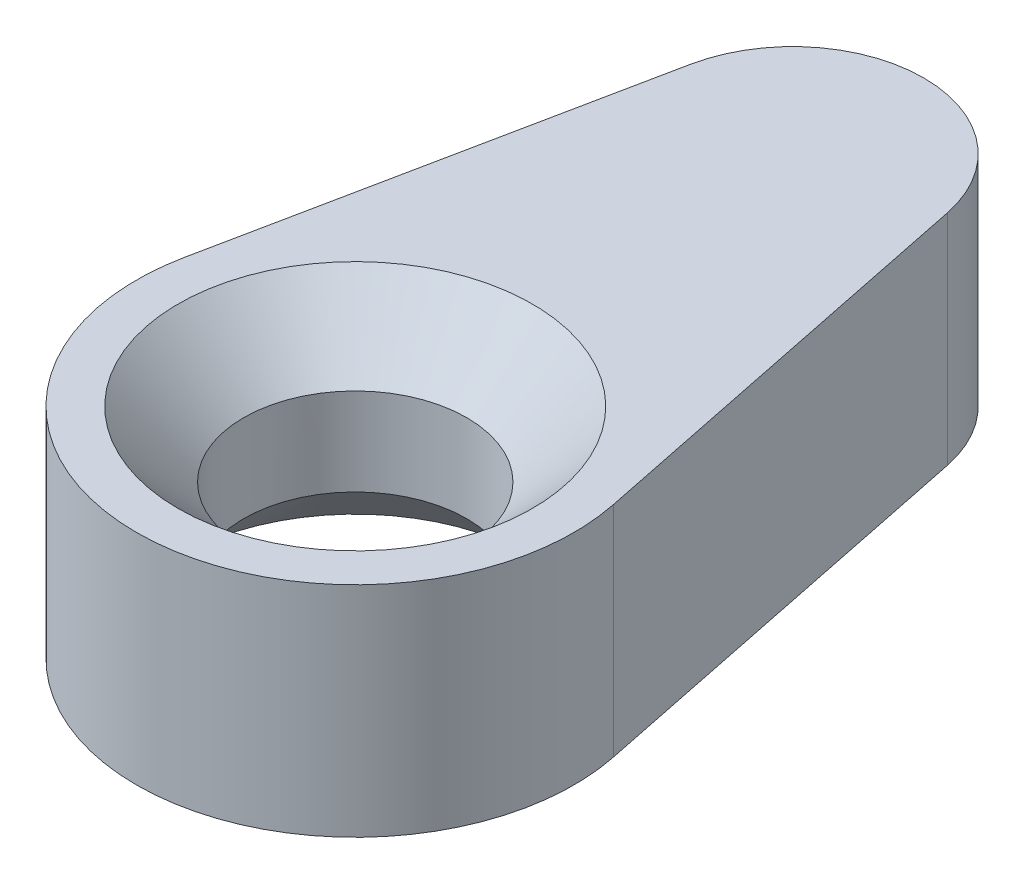
ISO-10303-21;
HEADER;
FILE_DESCRIPTION(('STEP AP214'),'2;1');
FILE_NAME('part.step','',(''),(''),'','','');
FILE_SCHEMA(('AUTOMOTIVE_DESIGN { 1 0 10303 214 1 1 1 1 }'));
ENDSEC;
DATA;
#1=APPLICATION_CONTEXT('core data for automotive mechanical design processes');
#2=APPLICATION_PROTOCOL_DEFINITION('international standard','automotive_design',2000,#1);
#3=PRODUCT_CONTEXT('',#1,'mechanical');
#4=PRODUCT('Part','Part','',(#3));
#5=PRODUCT_RELATED_PRODUCT_CATEGORY('part','',(#4));
#6=PRODUCT_DEFINITION_FORMATION('','',#4);
#7=PRODUCT_DEFINITION_CONTEXT('part definition',#1,'design');
#8=PRODUCT_DEFINITION('design','',#6,#7);
#9=PRODUCT_DEFINITION_SHAPE('','',#8);
#10=(LENGTH_UNIT() NAMED_UNIT(*) SI_UNIT(.MILLI.,.METRE.));
#11=(NAMED_UNIT(*) PLANE_ANGLE_UNIT() SI_UNIT($,.RADIAN.));
#12=(NAMED_UNIT(*) SI_UNIT($,.STERADIAN.) SOLID_ANGLE_UNIT());
#13=UNCERTAINTY_MEASURE_WITH_UNIT(LENGTH_MEASURE(1.E-05),#10,'distance_accuracy_value','');
#14=(GEOMETRIC_REPRESENTATION_CONTEXT(3) GLOBAL_UNCERTAINTY_ASSIGNED_CONTEXT((#13)) GLOBAL_UNIT_ASSIGNED_CONTEXT((#10,
#11,#12)) REPRESENTATION_CONTEXT('',''));
#15=CARTESIAN_POINT('',(0.,0.,0.));
#16=DIRECTION('',(0.,0.,1.));
#17=DIRECTION('',(1.,0.,0.));
#18=AXIS2_PLACEMENT_3D('',#15,#16,#17);
#19=CARTESIAN_POINT('',(0.,12.7,-25.4));
#20=DIRECTION('',(0.,-1.,0.));
#21=DIRECTION('',(0.,0.,-1.));
#22=AXIS2_PLACEMENT_3D('',#19,#20,#21);
#23=CYLINDRICAL_SURFACE('',#22,7.62);
#24=CARTESIAN_POINT('',(0.,0.,-25.4));
#25=DIRECTION('',(0.,1.,0.));
#26=DIRECTION('',(0.,0.,1.));
#27=AXIS2_PLACEMENT_3D('',#24,#25,#26);
#28=CIRCLE('',#27,7.62);
#29=CARTESIAN_POINT('',(-7.46604473600312,0.,-26.924));
#30=VERTEX_POINT('',#29);
#31=CARTESIAN_POINT('',(7.46604473600312,0.,-26.924));
#32=VERTEX_POINT('',#31);
#33=EDGE_CURVE('E125',#30,#32,#28,.F.);
#34=ORIENTED_EDGE('',*,*,#33,.F.);
#35=DIRECTION('',(0.,-1.,0.));
#36=VECTOR('',#35,1.);
#37=CARTESIAN_POINT('',(-7.46604473600312,12.7,-26.924));
#38=LINE('',#37,#36);
#39=CARTESIAN_POINT('',(-7.46604473600312,12.7,-26.924));
#40=VERTEX_POINT('',#39);
#41=EDGE_CURVE('E91',#40,#30,#38,.T.);
#42=ORIENTED_EDGE('',*,*,#41,.F.);
#43=CARTESIAN_POINT('',(0.,12.7,-25.4));
#44=DIRECTION('',(0.,1.,0.));
#45=DIRECTION('',(0.,0.,1.));
#46=AXIS2_PLACEMENT_3D('',#43,#44,#45);
#47=CIRCLE('',#46,7.62);
#48=CARTESIAN_POINT('',(7.46604473600312,12.7,-26.924));
#49=VERTEX_POINT('',#48);
#50=EDGE_CURVE('E116',#40,#49,#47,.F.);
#51=ORIENTED_EDGE('',*,*,#50,.T.);
#52=DIRECTION('',(0.,-1.,0.));
#53=VECTOR('',#52,1.);
#54=CARTESIAN_POINT('',(7.46604473600312,12.7,-26.924));
#55=LINE('',#54,#53);
#56=EDGE_CURVE('E68',#49,#32,#55,.T.);
#57=ORIENTED_EDGE('',*,*,#56,.T.);
#58=EDGE_LOOP('',(#34,#42,#51,#57));
#59=FACE_BOUND('',#58,.T.);
#60=ADVANCED_FACE('F49',(#59),#23,.T.);
#61=CARTESIAN_POINT('',(-12.4434078933385,12.7,-2.54));
#62=DIRECTION('',(-0.979795897113271,0.,-0.2));
#63=DIRECTION('',(-0.2,0.,0.979795897113271));
#64=AXIS2_PLACEMENT_3D('',#61,#62,#63);
#65=PLANE('',#64);
#66=DIRECTION('',(0.2,0.,-0.979795897113271));
#67=VECTOR('',#66,1.);
#68=CARTESIAN_POINT('',(-12.4434078933385,0.,-2.54));
#69=LINE('',#68,#67);
#70=CARTESIAN_POINT('',(-12.4434078933385,0.,-2.54));
#71=VERTEX_POINT('',#70);
#72=EDGE_CURVE('E103',#71,#30,#69,.T.);
#73=ORIENTED_EDGE('',*,*,#72,.F.);
#74=DIRECTION('',(0.,-1.,0.));
#75=VECTOR('',#74,1.);
#76=CARTESIAN_POINT('',(-12.4434078933385,12.7,-2.54));
#77=LINE('',#76,#75);
#78=CARTESIAN_POINT('',(-12.4434078933385,12.7,-2.54));
#79=VERTEX_POINT('',#78);
#80=EDGE_CURVE('E97',#79,#71,#77,.T.);
#81=ORIENTED_EDGE('',*,*,#80,.F.);
#82=DIRECTION('',(0.2,0.,-0.979795897113271));
#83=VECTOR('',#82,1.);
#84=CARTESIAN_POINT('',(-12.4434078933385,12.7,-2.54));
#85=LINE('',#84,#83);
#86=EDGE_CURVE('E101',#79,#40,#85,.T.);
#87=ORIENTED_EDGE('',*,*,#86,.T.);
#88=ORIENTED_EDGE('',*,*,#41,.T.);
#89=EDGE_LOOP('',(#73,#81,#87,#88));
#90=FACE_BOUND('',#89,.T.);
#91=ADVANCED_FACE('F99',(#90),#65,.T.);
#92=CARTESIAN_POINT('',(0.,12.7,0.));
#93=DIRECTION('',(0.,-1.,0.));
#94=DIRECTION('',(0.,0.,-1.));
#95=AXIS2_PLACEMENT_3D('',#92,#93,#94);
#96=CYLINDRICAL_SURFACE('',#95,12.7);
#97=CARTESIAN_POINT('',(0.,0.,0.));
#98=DIRECTION('',(0.,1.,0.));
#99=DIRECTION('',(0.,0.,1.));
#100=AXIS2_PLACEMENT_3D('',#97,#98,#99);
#101=CIRCLE('',#100,12.7);
#102=CARTESIAN_POINT('',(12.4434078933385,0.,-2.54));
#103=VERTEX_POINT('',#102);
#104=EDGE_CURVE('E130',#71,#103,#101,.T.);
#105=ORIENTED_EDGE('',*,*,#104,.T.);
#106=DIRECTION('',(0.,-1.,0.));
#107=VECTOR('',#106,1.);
#108=CARTESIAN_POINT('',(12.4434078933385,12.7,-2.54));
#109=LINE('',#108,#107);
#110=CARTESIAN_POINT('',(12.4434078933385,12.7,-2.54));
#111=VERTEX_POINT('',#110);
#112=EDGE_CURVE('E83',#111,#103,#109,.T.);
#113=ORIENTED_EDGE('',*,*,#112,.F.);
#114=CARTESIAN_POINT('',(0.,12.7,0.));
#115=DIRECTION('',(0.,1.,0.));
#116=DIRECTION('',(0.,0.,1.));
#117=AXIS2_PLACEMENT_3D('',#114,#115,#116);
#118=CIRCLE('',#117,12.7);
#119=EDGE_CURVE('E108',#79,#111,#118,.T.);
#120=ORIENTED_EDGE('',*,*,#119,.F.);
#121=ORIENTED_EDGE('',*,*,#80,.T.);
#122=EDGE_LOOP('',(#105,#113,#120,#121));
#123=FACE_BOUND('',#122,.T.);
#124=ADVANCED_FACE('F109',(#123),#96,.T.);
#125=CARTESIAN_POINT('',(12.4434078933385,12.7,-2.54));
#126=DIRECTION('',(0.979795897113271,0.,-0.2));
#127=DIRECTION('',(-0.2,0.,-0.979795897113271));
#128=AXIS2_PLACEMENT_3D('',#125,#126,#127);
#129=PLANE('',#128);
#130=DIRECTION('',(0.2,0.,0.979795897113271));
#131=VECTOR('',#130,1.);
#132=CARTESIAN_POINT('',(12.4434078933385,0.,-2.54));
#133=LINE('',#132,#131);
#134=EDGE_CURVE('E120',#32,#103,#133,.T.);
#135=ORIENTED_EDGE('',*,*,#134,.F.);
#136=ORIENTED_EDGE('',*,*,#56,.F.);
#137=DIRECTION('',(0.2,0.,0.979795897113271));
#138=VECTOR('',#137,1.);
#139=CARTESIAN_POINT('',(12.4434078933385,12.7,-2.54));
#140=LINE('',#139,#138);
#141=EDGE_CURVE('E113',#49,#111,#140,.T.);
#142=ORIENTED_EDGE('',*,*,#141,.T.);
#143=ORIENTED_EDGE('',*,*,#112,.T.);
#144=EDGE_LOOP('',(#135,#136,#142,#143));
#145=FACE_BOUND('',#144,.T.);
#146=ADVANCED_FACE('F165',(#145),#129,.T.);
#147=CARTESIAN_POINT('',(0.,12.7,0.));
#148=DIRECTION('',(0.,-1.,0.));
#149=DIRECTION('',(0.,0.,-1.));
#150=AXIS2_PLACEMENT_3D('',#147,#148,#149);
#151=CYLINDRICAL_SURFACE('',#150,6.477);
#152=CARTESIAN_POINT('',(0.,3.81000000000001,0.));
#153=DIRECTION('',(0.,1.,0.));
#154=DIRECTION('',(0.,0.,1.));
#155=AXIS2_PLACEMENT_3D('',#152,#153,#154);
#156=CIRCLE('',#155,6.477);
#157=CARTESIAN_POINT('',(0.,3.81000000000001,-6.477));
#158=VERTEX_POINT('',#157);
#159=EDGE_CURVE('E60',#158,#158,#156,.F.);
#160=ORIENTED_EDGE('',*,*,#159,.T.);
#161=EDGE_LOOP('',(#160));
#162=FACE_BOUND('',#161,.T.);
#163=CARTESIAN_POINT('',(0.,8.89000000000001,0.));
#164=DIRECTION('',(0.,1.,0.));
#165=DIRECTION('',(0.,0.,1.));
#166=AXIS2_PLACEMENT_3D('',#163,#164,#165);
#167=CIRCLE('',#166,6.477);
#168=CARTESIAN_POINT('',(0.,8.89000000000001,6.477));
#169=VERTEX_POINT('',#168);
#170=EDGE_CURVE('E146',#169,#169,#167,.T.);
#171=ORIENTED_EDGE('',*,*,#170,.T.);
#172=EDGE_LOOP('',(#171));
#173=FACE_BOUND('',#172,.T.);
#174=ADVANCED_FACE('F153',(#162,#173),#151,.F.);
#175=CARTESIAN_POINT('',(0.,12.7,0.));
#176=DIRECTION('',(0.,1.,0.));
#177=DIRECTION('',(0.,0.,1.));
#178=AXIS2_PLACEMENT_3D('',#175,#176,#177);
#179=PLANE('',#178);
#180=CARTESIAN_POINT('',(0.,12.7,0.));
#181=DIRECTION('',(0.,1.,0.));
#182=DIRECTION('',(0.,0.,1.));
#183=AXIS2_PLACEMENT_3D('',#180,#181,#182);
#184=CIRCLE('',#183,10.287);
#185=CARTESIAN_POINT('',(0.,12.7,10.287));
#186=VERTEX_POINT('',#185);
#187=EDGE_CURVE('E11',#186,#186,#184,.F.);
#188=ORIENTED_EDGE('',*,*,#187,.T.);
#189=EDGE_LOOP('',(#188));
#190=FACE_BOUND('',#189,.T.);
#191=ORIENTED_EDGE('',*,*,#50,.F.);
#192=ORIENTED_EDGE('',*,*,#86,.F.);
#193=ORIENTED_EDGE('',*,*,#119,.T.);
#194=ORIENTED_EDGE('',*,*,#141,.F.);
#195=EDGE_LOOP('',(#191,#192,#193,#194));
#196=FACE_BOUND('',#195,.T.);
#197=ADVANCED_FACE('F115',(#190,#196),#179,.T.);
#198=CARTESIAN_POINT('',(0.,0.,0.));
#199=DIRECTION('',(0.,1.,0.));
#200=DIRECTION('',(0.,0.,1.));
#201=AXIS2_PLACEMENT_3D('',#198,#199,#200);
#202=PLANE('',#201);
#203=CARTESIAN_POINT('',(0.,0.,0.));
#204=DIRECTION('',(0.,1.,0.));
#205=DIRECTION('',(0.,0.,1.));
#206=AXIS2_PLACEMENT_3D('',#203,#204,#205);
#207=CIRCLE('',#206,10.287);
#208=CARTESIAN_POINT('',(0.,0.,-10.287));
#209=VERTEX_POINT('',#208);
#210=EDGE_CURVE('E142',#209,#209,#207,.T.);
#211=ORIENTED_EDGE('',*,*,#210,.T.);
#212=EDGE_LOOP('',(#211));
#213=FACE_BOUND('',#212,.T.);
#214=ORIENTED_EDGE('',*,*,#33,.T.);
#215=ORIENTED_EDGE('',*,*,#134,.T.);
#216=ORIENTED_EDGE('',*,*,#104,.F.);
#217=ORIENTED_EDGE('',*,*,#72,.T.);
#218=EDGE_LOOP('',(#214,#215,#216,#217));
#219=FACE_BOUND('',#218,.T.);
#220=ADVANCED_FACE('F159',(#213,#219),#202,.F.);
#221=CARTESIAN_POINT('',(0.,0.,0.));
#222=DIRECTION('',(0.,-1.,0.));
#223=DIRECTION('',(0.,0.,-1.));
#224=AXIS2_PLACEMENT_3D('',#221,#222,#223);
#225=CONICAL_SURFACE('',#224,10.287,0.785398163397447);
#226=CARTESIAN_POINT('',(0.,3.81000000000001,-6.477));
#227=CARTESIAN_POINT('',(0.,3.77031250000001,-6.5166875));
#228=CARTESIAN_POINT('',(0.,3.73062500000001,-6.556375));
#229=CARTESIAN_POINT('',(0.,3.65125000000001,-6.63575));
#230=CARTESIAN_POINT('',(0.,3.61156250000001,-6.6754375));
#231=CARTESIAN_POINT('',(0.,3.53218750000001,-6.7548125));
#232=CARTESIAN_POINT('',(0.,3.49250000000001,-6.7945));
#233=CARTESIAN_POINT('',(0.,3.41312500000001,-6.873875));
#234=CARTESIAN_POINT('',(0.,3.37343750000001,-6.9135625));
#235=CARTESIAN_POINT('',(0.,3.29406250000001,-6.9929375));
#236=CARTESIAN_POINT('',(0.,3.25437500000001,-7.032625));
#237=CARTESIAN_POINT('',(0.,3.17500000000001,-7.112));
#238=CARTESIAN_POINT('',(0.,3.13531250000001,-7.1516875));
#239=CARTESIAN_POINT('',(0.,3.05593750000001,-7.2310625));
#240=CARTESIAN_POINT('',(0.,3.01625000000001,-7.27075));
#241=CARTESIAN_POINT('',(0.,2.93687500000001,-7.350125));
#242=CARTESIAN_POINT('',(0.,2.89718750000001,-7.3898125));
#243=CARTESIAN_POINT('',(0.,2.81781250000001,-7.4691875));
#244=CARTESIAN_POINT('',(0.,2.77812500000001,-7.508875));
#245=CARTESIAN_POINT('',(0.,2.69875000000001,-7.58825));
#246=CARTESIAN_POINT('',(0.,2.65906250000001,-7.6279375));
#247=CARTESIAN_POINT('',(0.,2.57968750000001,-7.7073125));
#248=CARTESIAN_POINT('',(0.,2.54000000000001,-7.747));
#249=CARTESIAN_POINT('',(0.,2.46062500000001,-7.826375));
#250=CARTESIAN_POINT('',(0.,2.42093750000001,-7.8660625));
#251=CARTESIAN_POINT('',(0.,2.34156250000001,-7.9454375));
#252=CARTESIAN_POINT('',(0.,2.30187500000001,-7.985125));
#253=CARTESIAN_POINT('',(0.,2.22250000000001,-8.0645));
#254=CARTESIAN_POINT('',(0.,2.1828125,-8.1041875));
#255=CARTESIAN_POINT('',(0.,2.1034375,-8.1835625));
#256=CARTESIAN_POINT('',(0.,2.06375,-8.22325));
#257=CARTESIAN_POINT('',(0.,1.984375,-8.302625));
#258=CARTESIAN_POINT('',(0.,1.9446875,-8.3423125));
#259=CARTESIAN_POINT('',(0.,1.8653125,-8.4216875));
#260=CARTESIAN_POINT('',(0.,1.825625,-8.461375));
#261=CARTESIAN_POINT('',(0.,1.74625,-8.54075));
#262=CARTESIAN_POINT('',(0.,1.7065625,-8.5804375));
#263=CARTESIAN_POINT('',(0.,1.6271875,-8.6598125));
#264=CARTESIAN_POINT('',(0.,1.5875,-8.6995));
#265=CARTESIAN_POINT('',(0.,1.508125,-8.778875));
#266=CARTESIAN_POINT('',(0.,1.4684375,-8.8185625));
#267=CARTESIAN_POINT('',(0.,1.3890625,-8.8979375));
#268=CARTESIAN_POINT('',(0.,1.349375,-8.937625));
#269=CARTESIAN_POINT('',(0.,1.27,-9.017));
#270=CARTESIAN_POINT('',(0.,1.2303125,-9.0566875));
#271=CARTESIAN_POINT('',(0.,1.1509375,-9.1360625));
#272=CARTESIAN_POINT('',(0.,1.11125,-9.17575));
#273=CARTESIAN_POINT('',(0.,1.031875,-9.255125));
#274=CARTESIAN_POINT('',(0.,0.992187500000002,-9.2948125));
#275=CARTESIAN_POINT('',(0.,0.912812500000002,-9.3741875));
#276=CARTESIAN_POINT('',(0.,0.873125000000002,-9.413875));
#277=CARTESIAN_POINT('',(0.,0.793750000000002,-9.49325));
#278=CARTESIAN_POINT('',(0.,0.754062500000002,-9.5329375));
#279=CARTESIAN_POINT('',(0.,0.674687500000002,-9.6123125));
#280=CARTESIAN_POINT('',(0.,0.635000000000001,-9.652));
#281=CARTESIAN_POINT('',(0.,0.555625000000001,-9.731375));
#282=CARTESIAN_POINT('',(0.,0.515937500000001,-9.7710625));
#283=CARTESIAN_POINT('',(0.,0.436562500000001,-9.8504375));
#284=CARTESIAN_POINT('',(0.,0.396875000000001,-9.890125));
#285=CARTESIAN_POINT('',(0.,0.317500000000001,-9.9695));
#286=CARTESIAN_POINT('',(0.,0.2778125,-10.0091875));
#287=CARTESIAN_POINT('',(0.,0.1984375,-10.0885625));
#288=CARTESIAN_POINT('',(0.,0.15875,-10.12825));
#289=CARTESIAN_POINT('',(0.,0.0793750000000004,-10.207625));
#290=CARTESIAN_POINT('',(0.,0.0396875000000006,-10.2473125));
#291=CARTESIAN_POINT('',(0.,0.,-10.287));
#292=B_SPLINE_CURVE_WITH_KNOTS('',3,(#226,#227,#228,#229,#230,#231,#232,#233,#234,#235,#236,
#237,#238,#239,#240,#241,#242,#243,#244,#245,#246,#247,#248,#249,#250,#251,#252,#253,#254,#255,
#256,#257,#258,#259,#260,#261,#262,#263,#264,#265,#266,#267,#268,#269,#270,#271,#272,#273,#274,
#275,#276,#277,#278,#279,#280,#281,#282,#283,#284,#285,#286,#287,#288,#289,#290,#291),
.UNSPECIFIED.,.F.,.F.,(4,2,2,2,2,2,2,2,2,2,2,2,2,2,2,2,2,2,2,2,2,2,2,2,2,2,2,2,2,2,2,2,4),(0.,
0.168379802270046,0.336759604540093,0.50513940681014,0.673519209080187,0.841899011350233,
1.01027881362028,1.17865861589033,1.34703841816037,1.51541822043042,1.68379802270047,
1.85217782497051,2.02055762724056,2.18893742951061,2.35731723178065,2.5256970340507,
2.69407683632075,2.86245663859079,3.03083644086084,3.19921624313089,3.36759604540093,
3.53597584767098,3.70435564994103,3.87273545221107,4.04111525448112,4.20949505675117,
4.37787485902121,4.54625466129126,4.71463446356131,4.88301426583136,5.0513940681014,
5.21977387037145,5.3881536726415),.UNSPECIFIED.);
#293=EDGE_CURVE('BSEAM156',#158,#209,#292,.T.);
#294=ORIENTED_EDGE('',*,*,#159,.F.);
#295=ORIENTED_EDGE('',*,*,#210,.F.);
#296=ORIENTED_EDGE('',*,*,#293,.T.);
#297=ORIENTED_EDGE('',*,*,#293,.F.);
#298=EDGE_LOOP('',(#294,#296,#295,#297));
#299=FACE_BOUND('',#298,.T.);
#300=ADVANCED_FACE('F156',(#299),#225,.F.);
#301=CARTESIAN_POINT('',(0.,8.89000000000001,0.));
#302=DIRECTION('',(0.,1.,0.));
#303=DIRECTION('',(0.,0.,1.));
#304=AXIS2_PLACEMENT_3D('',#301,#302,#303);
#305=CONICAL_SURFACE('',#304,6.477,0.785398163397451);
#306=ORIENTED_EDGE('',*,*,#187,.F.);
#307=EDGE_LOOP('',(#306));
#308=FACE_BOUND('',#307,.T.);
#309=ORIENTED_EDGE('',*,*,#170,.F.);
#310=EDGE_LOOP('',(#309));
#311=FACE_BOUND('',#310,.T.);
#312=ADVANCED_FACE('F52',(#308,#311),#305,.F.);
#313=CLOSED_SHELL('',(#60,#91,#124,#146,#174,#197,#220,#300,#312));
#314=MANIFOLD_SOLID_BREP('B2',#313);
#315=ADVANCED_BREP_SHAPE_REPRESENTATION('',(#18,#314),#14);
#316=SHAPE_DEFINITION_REPRESENTATION(#9,#315);
ENDSEC;
END-ISO-10303-21;
